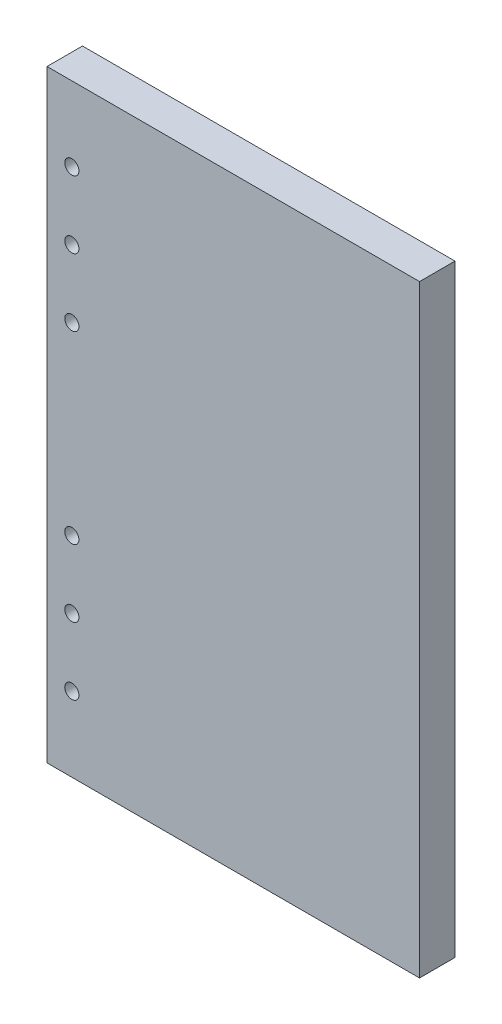
ISO-10303-21;
HEADER;
FILE_DESCRIPTION(('STEP AP214'),'2;1');
FILE_NAME('part.step','',(''),(''),'','','');
FILE_SCHEMA(('AUTOMOTIVE_DESIGN { 1 0 10303 214 1 1 1 1 }'));
ENDSEC;
DATA;
#1=APPLICATION_CONTEXT('core data for automotive mechanical design processes');
#2=APPLICATION_PROTOCOL_DEFINITION('international standard','automotive_design',2000,#1);
#3=PRODUCT_CONTEXT('',#1,'mechanical');
#4=PRODUCT('Part','Part','',(#3));
#5=PRODUCT_RELATED_PRODUCT_CATEGORY('part','',(#4));
#6=PRODUCT_DEFINITION_FORMATION('','',#4);
#7=PRODUCT_DEFINITION_CONTEXT('part definition',#1,'design');
#8=PRODUCT_DEFINITION('design','',#6,#7);
#9=PRODUCT_DEFINITION_SHAPE('','',#8);
#10=(LENGTH_UNIT() NAMED_UNIT(*) SI_UNIT(.MILLI.,.METRE.));
#11=(NAMED_UNIT(*) PLANE_ANGLE_UNIT() SI_UNIT($,.RADIAN.));
#12=(NAMED_UNIT(*) SI_UNIT($,.STERADIAN.) SOLID_ANGLE_UNIT());
#13=UNCERTAINTY_MEASURE_WITH_UNIT(LENGTH_MEASURE(1.E-05),#10,'distance_accuracy_value','');
#14=(GEOMETRIC_REPRESENTATION_CONTEXT(3) GLOBAL_UNCERTAINTY_ASSIGNED_CONTEXT((#13)) GLOBAL_UNIT_ASSIGNED_CONTEXT((#10,
#11,#12)) REPRESENTATION_CONTEXT('',''));
#15=CARTESIAN_POINT('',(0.,0.,0.));
#16=DIRECTION('',(0.,0.,1.));
#17=DIRECTION('',(1.,0.,0.));
#18=AXIS2_PLACEMENT_3D('',#15,#16,#17);
#19=CARTESIAN_POINT('',(0.,0.,10.));
#20=DIRECTION('',(0.,0.,-1.));
#21=DIRECTION('',(-1.,0.,0.));
#22=AXIS2_PLACEMENT_3D('',#19,#20,#21);
#23=PLANE('',#22);
#24=DIRECTION('',(0.,-1.,0.));
#25=VECTOR('',#24,1.);
#26=CARTESIAN_POINT('',(0.,0.,10.));
#27=LINE('',#26,#25);
#28=CARTESIAN_POINT('',(0.,170.,10.));
#29=VERTEX_POINT('',#28);
#30=CARTESIAN_POINT('',(0.,0.,10.));
#31=VERTEX_POINT('',#30);
#32=EDGE_CURVE('E87',#29,#31,#27,.T.);
#33=ORIENTED_EDGE('',*,*,#32,.T.);
#34=DIRECTION('',(1.,0.,0.));
#35=VECTOR('',#34,1.);
#36=CARTESIAN_POINT('',(0.,0.,10.));
#37=LINE('',#36,#35);
#38=CARTESIAN_POINT('',(105.,0.,10.));
#39=VERTEX_POINT('',#38);
#40=EDGE_CURVE('E82',#31,#39,#37,.T.);
#41=ORIENTED_EDGE('',*,*,#40,.T.);
#42=DIRECTION('',(0.,1.,0.));
#43=VECTOR('',#42,1.);
#44=CARTESIAN_POINT('',(105.,0.,10.));
#45=LINE('',#44,#43);
#46=CARTESIAN_POINT('',(105.,170.,10.));
#47=VERTEX_POINT('',#46);
#48=EDGE_CURVE('E85',#39,#47,#45,.T.);
#49=ORIENTED_EDGE('',*,*,#48,.T.);
#50=DIRECTION('',(-1.,0.,0.));
#51=VECTOR('',#50,1.);
#52=CARTESIAN_POINT('',(0.,170.,10.));
#53=LINE('',#52,#51);
#54=EDGE_CURVE('E52',#47,#29,#53,.T.);
#55=ORIENTED_EDGE('',*,*,#54,.T.);
#56=EDGE_LOOP('',(#33,#41,#49,#55));
#57=FACE_BOUND('',#56,.T.);
#58=CARTESIAN_POINT('',(7.,111.,10.));
#59=DIRECTION('',(0.,0.,1.));
#60=DIRECTION('',(1.,0.,0.));
#61=AXIS2_PLACEMENT_3D('',#58,#59,#60);
#62=CIRCLE('',#61,2.);
#63=CARTESIAN_POINT('',(9.,111.,10.));
#64=VERTEX_POINT('',#63);
#65=EDGE_CURVE('E102',#64,#64,#62,.T.);
#66=ORIENTED_EDGE('',*,*,#65,.F.);
#67=EDGE_LOOP('',(#66));
#68=FACE_BOUND('',#67,.T.);
#69=CARTESIAN_POINT('',(7.,130.,10.));
#70=DIRECTION('',(0.,0.,1.));
#71=DIRECTION('',(1.,0.,0.));
#72=AXIS2_PLACEMENT_3D('',#69,#70,#71);
#73=CIRCLE('',#72,2.);
#74=CARTESIAN_POINT('',(9.,130.,10.));
#75=VERTEX_POINT('',#74);
#76=EDGE_CURVE('E117',#75,#75,#73,.T.);
#77=ORIENTED_EDGE('',*,*,#76,.F.);
#78=EDGE_LOOP('',(#77));
#79=FACE_BOUND('',#78,.T.);
#80=CARTESIAN_POINT('',(7.,149.,10.));
#81=DIRECTION('',(0.,0.,1.));
#82=DIRECTION('',(1.,0.,0.));
#83=AXIS2_PLACEMENT_3D('',#80,#81,#82);
#84=CIRCLE('',#83,2.);
#85=CARTESIAN_POINT('',(9.,149.,10.));
#86=VERTEX_POINT('',#85);
#87=EDGE_CURVE('E123',#86,#86,#84,.T.);
#88=ORIENTED_EDGE('',*,*,#87,.F.);
#89=EDGE_LOOP('',(#88));
#90=FACE_BOUND('',#89,.T.);
#91=CARTESIAN_POINT('',(7.,21.,10.));
#92=DIRECTION('',(0.,0.,1.));
#93=DIRECTION('',(-1.,0.,0.));
#94=AXIS2_PLACEMENT_3D('',#91,#92,#93);
#95=CIRCLE('',#94,2.);
#96=CARTESIAN_POINT('',(5.,21.,10.));
#97=VERTEX_POINT('',#96);
#98=EDGE_CURVE('E129',#97,#97,#95,.T.);
#99=ORIENTED_EDGE('',*,*,#98,.F.);
#100=EDGE_LOOP('',(#99));
#101=FACE_BOUND('',#100,.T.);
#102=CARTESIAN_POINT('',(7.,40.,10.));
#103=DIRECTION('',(0.,0.,1.));
#104=DIRECTION('',(-1.,0.,0.));
#105=AXIS2_PLACEMENT_3D('',#102,#103,#104);
#106=CIRCLE('',#105,2.);
#107=CARTESIAN_POINT('',(5.,40.,10.));
#108=VERTEX_POINT('',#107);
#109=EDGE_CURVE('E135',#108,#108,#106,.T.);
#110=ORIENTED_EDGE('',*,*,#109,.F.);
#111=EDGE_LOOP('',(#110));
#112=FACE_BOUND('',#111,.T.);
#113=CARTESIAN_POINT('',(7.,59.,10.));
#114=DIRECTION('',(0.,0.,1.));
#115=DIRECTION('',(-1.,0.,0.));
#116=AXIS2_PLACEMENT_3D('',#113,#114,#115);
#117=CIRCLE('',#116,2.);
#118=CARTESIAN_POINT('',(5.00000000000001,59.,10.));
#119=VERTEX_POINT('',#118);
#120=EDGE_CURVE('E141',#119,#119,#117,.T.);
#121=ORIENTED_EDGE('',*,*,#120,.F.);
#122=EDGE_LOOP('',(#121));
#123=FACE_BOUND('',#122,.T.);
#124=ADVANCED_FACE('F35',(#57,#68,#79,#90,#101,#112,#123),#23,.F.);
#125=CARTESIAN_POINT('',(0.,0.,0.));
#126=DIRECTION('',(0.,0.,-1.));
#127=DIRECTION('',(-1.,0.,0.));
#128=AXIS2_PLACEMENT_3D('',#125,#126,#127);
#129=PLANE('',#128);
#130=CARTESIAN_POINT('',(7.,40.,0.));
#131=DIRECTION('',(0.,0.,1.));
#132=DIRECTION('',(-1.,0.,0.));
#133=AXIS2_PLACEMENT_3D('',#130,#131,#132);
#134=CIRCLE('',#133,2.);
#135=CARTESIAN_POINT('',(5.,40.,0.));
#136=VERTEX_POINT('',#135);
#137=EDGE_CURVE('E138',#136,#136,#134,.T.);
#138=ORIENTED_EDGE('',*,*,#137,.T.);
#139=EDGE_LOOP('',(#138));
#140=FACE_BOUND('',#139,.T.);
#141=CARTESIAN_POINT('',(7.,149.,0.));
#142=DIRECTION('',(0.,0.,1.));
#143=DIRECTION('',(1.,0.,0.));
#144=AXIS2_PLACEMENT_3D('',#141,#142,#143);
#145=CIRCLE('',#144,2.);
#146=CARTESIAN_POINT('',(9.,149.,0.));
#147=VERTEX_POINT('',#146);
#148=EDGE_CURVE('E126',#147,#147,#145,.T.);
#149=ORIENTED_EDGE('',*,*,#148,.T.);
#150=EDGE_LOOP('',(#149));
#151=FACE_BOUND('',#150,.T.);
#152=CARTESIAN_POINT('',(7.,111.,0.));
#153=DIRECTION('',(0.,0.,1.));
#154=DIRECTION('',(1.,0.,0.));
#155=AXIS2_PLACEMENT_3D('',#152,#153,#154);
#156=CIRCLE('',#155,2.);
#157=CARTESIAN_POINT('',(9.,111.,0.));
#158=VERTEX_POINT('',#157);
#159=EDGE_CURVE('E114',#158,#158,#156,.T.);
#160=ORIENTED_EDGE('',*,*,#159,.T.);
#161=EDGE_LOOP('',(#160));
#162=FACE_BOUND('',#161,.T.);
#163=DIRECTION('',(0.,-1.,0.));
#164=VECTOR('',#163,1.);
#165=CARTESIAN_POINT('',(0.,0.,0.));
#166=LINE('',#165,#164);
#167=CARTESIAN_POINT('',(0.,170.,0.));
#168=VERTEX_POINT('',#167);
#169=CARTESIAN_POINT('',(0.,0.,0.));
#170=VERTEX_POINT('',#169);
#171=EDGE_CURVE('E99',#168,#170,#166,.T.);
#172=ORIENTED_EDGE('',*,*,#171,.F.);
#173=DIRECTION('',(-1.,0.,0.));
#174=VECTOR('',#173,1.);
#175=CARTESIAN_POINT('',(0.,170.,0.));
#176=LINE('',#175,#174);
#177=CARTESIAN_POINT('',(105.,170.,0.));
#178=VERTEX_POINT('',#177);
#179=EDGE_CURVE('E75',#178,#168,#176,.T.);
#180=ORIENTED_EDGE('',*,*,#179,.F.);
#181=DIRECTION('',(0.,1.,0.));
#182=VECTOR('',#181,1.);
#183=CARTESIAN_POINT('',(105.,0.,0.));
#184=LINE('',#183,#182);
#185=CARTESIAN_POINT('',(105.,0.,0.));
#186=VERTEX_POINT('',#185);
#187=EDGE_CURVE('E69',#186,#178,#184,.T.);
#188=ORIENTED_EDGE('',*,*,#187,.F.);
#189=DIRECTION('',(1.,0.,0.));
#190=VECTOR('',#189,1.);
#191=CARTESIAN_POINT('',(0.,0.,0.));
#192=LINE('',#191,#190);
#193=EDGE_CURVE('E91',#170,#186,#192,.T.);
#194=ORIENTED_EDGE('',*,*,#193,.F.);
#195=EDGE_LOOP('',(#172,#180,#188,#194));
#196=FACE_BOUND('',#195,.T.);
#197=CARTESIAN_POINT('',(7.,130.,0.));
#198=DIRECTION('',(0.,0.,1.));
#199=DIRECTION('',(1.,0.,0.));
#200=AXIS2_PLACEMENT_3D('',#197,#198,#199);
#201=CIRCLE('',#200,2.);
#202=CARTESIAN_POINT('',(9.,130.,0.));
#203=VERTEX_POINT('',#202);
#204=EDGE_CURVE('E120',#203,#203,#201,.T.);
#205=ORIENTED_EDGE('',*,*,#204,.T.);
#206=EDGE_LOOP('',(#205));
#207=FACE_BOUND('',#206,.T.);
#208=CARTESIAN_POINT('',(7.,21.,0.));
#209=DIRECTION('',(0.,0.,1.));
#210=DIRECTION('',(-1.,0.,0.));
#211=AXIS2_PLACEMENT_3D('',#208,#209,#210);
#212=CIRCLE('',#211,2.);
#213=CARTESIAN_POINT('',(5.,21.,0.));
#214=VERTEX_POINT('',#213);
#215=EDGE_CURVE('E132',#214,#214,#212,.T.);
#216=ORIENTED_EDGE('',*,*,#215,.T.);
#217=EDGE_LOOP('',(#216));
#218=FACE_BOUND('',#217,.T.);
#219=CARTESIAN_POINT('',(7.,59.,0.));
#220=DIRECTION('',(0.,0.,1.));
#221=DIRECTION('',(-1.,0.,0.));
#222=AXIS2_PLACEMENT_3D('',#219,#220,#221);
#223=CIRCLE('',#222,2.);
#224=CARTESIAN_POINT('',(5.00000000000001,59.,0.));
#225=VERTEX_POINT('',#224);
#226=EDGE_CURVE('E144',#225,#225,#223,.T.);
#227=ORIENTED_EDGE('',*,*,#226,.T.);
#228=EDGE_LOOP('',(#227));
#229=FACE_BOUND('',#228,.T.);
#230=ADVANCED_FACE('F110',(#140,#151,#162,#196,#207,#218,#229),#129,.T.);
#231=CARTESIAN_POINT('',(0.,0.,10.));
#232=DIRECTION('',(1.,0.,0.));
#233=DIRECTION('',(0.,0.,-1.));
#234=AXIS2_PLACEMENT_3D('',#231,#232,#233);
#235=PLANE('',#234);
#236=ORIENTED_EDGE('',*,*,#171,.T.);
#237=DIRECTION('',(0.,0.,-1.));
#238=VECTOR('',#237,1.);
#239=CARTESIAN_POINT('',(0.,0.,10.));
#240=LINE('',#239,#238);
#241=EDGE_CURVE('E11',#31,#170,#240,.T.);
#242=ORIENTED_EDGE('',*,*,#241,.F.);
#243=ORIENTED_EDGE('',*,*,#32,.F.);
#244=DIRECTION('',(0.,0.,-1.));
#245=VECTOR('',#244,1.);
#246=CARTESIAN_POINT('',(0.,170.,10.));
#247=LINE('',#246,#245);
#248=EDGE_CURVE('E95',#29,#168,#247,.T.);
#249=ORIENTED_EDGE('',*,*,#248,.T.);
#250=EDGE_LOOP('',(#236,#242,#243,#249));
#251=FACE_BOUND('',#250,.T.);
#252=ADVANCED_FACE('F37',(#251),#235,.F.);
#253=CARTESIAN_POINT('',(0.,0.,10.));
#254=DIRECTION('',(0.,1.,0.));
#255=DIRECTION('',(0.,0.,1.));
#256=AXIS2_PLACEMENT_3D('',#253,#254,#255);
#257=PLANE('',#256);
#258=ORIENTED_EDGE('',*,*,#193,.T.);
#259=DIRECTION('',(0.,0.,-1.));
#260=VECTOR('',#259,1.);
#261=CARTESIAN_POINT('',(105.,0.,10.));
#262=LINE('',#261,#260);
#263=EDGE_CURVE('E44',#39,#186,#262,.T.);
#264=ORIENTED_EDGE('',*,*,#263,.F.);
#265=ORIENTED_EDGE('',*,*,#40,.F.);
#266=ORIENTED_EDGE('',*,*,#241,.T.);
#267=EDGE_LOOP('',(#258,#264,#265,#266));
#268=FACE_BOUND('',#267,.T.);
#269=ADVANCED_FACE('F90',(#268),#257,.F.);
#270=CARTESIAN_POINT('',(105.,0.,10.));
#271=DIRECTION('',(-1.,0.,0.));
#272=DIRECTION('',(0.,0.,1.));
#273=AXIS2_PLACEMENT_3D('',#270,#271,#272);
#274=PLANE('',#273);
#275=ORIENTED_EDGE('',*,*,#187,.T.);
#276=DIRECTION('',(0.,0.,-1.));
#277=VECTOR('',#276,1.);
#278=CARTESIAN_POINT('',(105.,170.,10.));
#279=LINE('',#278,#277);
#280=EDGE_CURVE('E92',#47,#178,#279,.T.);
#281=ORIENTED_EDGE('',*,*,#280,.F.);
#282=ORIENTED_EDGE('',*,*,#48,.F.);
#283=ORIENTED_EDGE('',*,*,#263,.T.);
#284=EDGE_LOOP('',(#275,#281,#282,#283));
#285=FACE_BOUND('',#284,.T.);
#286=ADVANCED_FACE('F93',(#285),#274,.F.);
#287=CARTESIAN_POINT('',(0.,170.,10.));
#288=DIRECTION('',(0.,-1.,0.));
#289=DIRECTION('',(0.,0.,-1.));
#290=AXIS2_PLACEMENT_3D('',#287,#288,#289);
#291=PLANE('',#290);
#292=ORIENTED_EDGE('',*,*,#179,.T.);
#293=ORIENTED_EDGE('',*,*,#248,.F.);
#294=ORIENTED_EDGE('',*,*,#54,.F.);
#295=ORIENTED_EDGE('',*,*,#280,.T.);
#296=EDGE_LOOP('',(#292,#293,#294,#295));
#297=FACE_BOUND('',#296,.T.);
#298=ADVANCED_FACE('F107',(#297),#291,.F.);
#299=CARTESIAN_POINT('',(7.,111.,10.));
#300=DIRECTION('',(0.,0.,-1.));
#301=DIRECTION('',(-1.,0.,0.));
#302=AXIS2_PLACEMENT_3D('',#299,#300,#301);
#303=CYLINDRICAL_SURFACE('',#302,2.);
#304=ORIENTED_EDGE('',*,*,#65,.T.);
#305=EDGE_LOOP('',(#304));
#306=FACE_BOUND('',#305,.T.);
#307=ORIENTED_EDGE('',*,*,#159,.F.);
#308=EDGE_LOOP('',(#307));
#309=FACE_BOUND('',#308,.T.);
#310=ADVANCED_FACE('F161',(#306,#309),#303,.F.);
#311=CARTESIAN_POINT('',(7.,130.,10.));
#312=DIRECTION('',(0.,0.,-1.));
#313=DIRECTION('',(-1.,0.,0.));
#314=AXIS2_PLACEMENT_3D('',#311,#312,#313);
#315=CYLINDRICAL_SURFACE('',#314,2.);
#316=ORIENTED_EDGE('',*,*,#76,.T.);
#317=EDGE_LOOP('',(#316));
#318=FACE_BOUND('',#317,.T.);
#319=ORIENTED_EDGE('',*,*,#204,.F.);
#320=EDGE_LOOP('',(#319));
#321=FACE_BOUND('',#320,.T.);
#322=ADVANCED_FACE('F207',(#318,#321),#315,.F.);
#323=CARTESIAN_POINT('',(7.,149.,10.));
#324=DIRECTION('',(0.,0.,-1.));
#325=DIRECTION('',(-1.,0.,0.));
#326=AXIS2_PLACEMENT_3D('',#323,#324,#325);
#327=CYLINDRICAL_SURFACE('',#326,2.);
#328=ORIENTED_EDGE('',*,*,#87,.T.);
#329=EDGE_LOOP('',(#328));
#330=FACE_BOUND('',#329,.T.);
#331=ORIENTED_EDGE('',*,*,#148,.F.);
#332=EDGE_LOOP('',(#331));
#333=FACE_BOUND('',#332,.T.);
#334=ADVANCED_FACE('F215',(#330,#333),#327,.F.);
#335=CARTESIAN_POINT('',(7.,21.,10.));
#336=DIRECTION('',(0.,0.,-1.));
#337=DIRECTION('',(-1.,0.,0.));
#338=AXIS2_PLACEMENT_3D('',#335,#336,#337);
#339=CYLINDRICAL_SURFACE('',#338,2.);
#340=ORIENTED_EDGE('',*,*,#98,.T.);
#341=EDGE_LOOP('',(#340));
#342=FACE_BOUND('',#341,.T.);
#343=ORIENTED_EDGE('',*,*,#215,.F.);
#344=EDGE_LOOP('',(#343));
#345=FACE_BOUND('',#344,.T.);
#346=ADVANCED_FACE('F223',(#342,#345),#339,.F.);
#347=CARTESIAN_POINT('',(7.,40.,10.));
#348=DIRECTION('',(0.,0.,-1.));
#349=DIRECTION('',(-1.,0.,0.));
#350=AXIS2_PLACEMENT_3D('',#347,#348,#349);
#351=CYLINDRICAL_SURFACE('',#350,2.);
#352=ORIENTED_EDGE('',*,*,#109,.T.);
#353=EDGE_LOOP('',(#352));
#354=FACE_BOUND('',#353,.T.);
#355=ORIENTED_EDGE('',*,*,#137,.F.);
#356=EDGE_LOOP('',(#355));
#357=FACE_BOUND('',#356,.T.);
#358=ADVANCED_FACE('F232',(#354,#357),#351,.F.);
#359=CARTESIAN_POINT('',(7.,59.,10.));
#360=DIRECTION('',(0.,0.,-1.));
#361=DIRECTION('',(-1.,0.,0.));
#362=AXIS2_PLACEMENT_3D('',#359,#360,#361);
#363=CYLINDRICAL_SURFACE('',#362,2.);
#364=ORIENTED_EDGE('',*,*,#120,.T.);
#365=EDGE_LOOP('',(#364));
#366=FACE_BOUND('',#365,.T.);
#367=ORIENTED_EDGE('',*,*,#226,.F.);
#368=EDGE_LOOP('',(#367));
#369=FACE_BOUND('',#368,.T.);
#370=ADVANCED_FACE('F150',(#366,#369),#363,.F.);
#371=CLOSED_SHELL('',(#124,#230,#252,#269,#286,#298,#310,#322,#334,#346,#358,#370));
#372=MANIFOLD_SOLID_BREP('B2',#371);
#373=ADVANCED_BREP_SHAPE_REPRESENTATION('',(#18,#372),#14);
#374=SHAPE_DEFINITION_REPRESENTATION(#9,#373);
ENDSEC;
END-ISO-10303-21;
